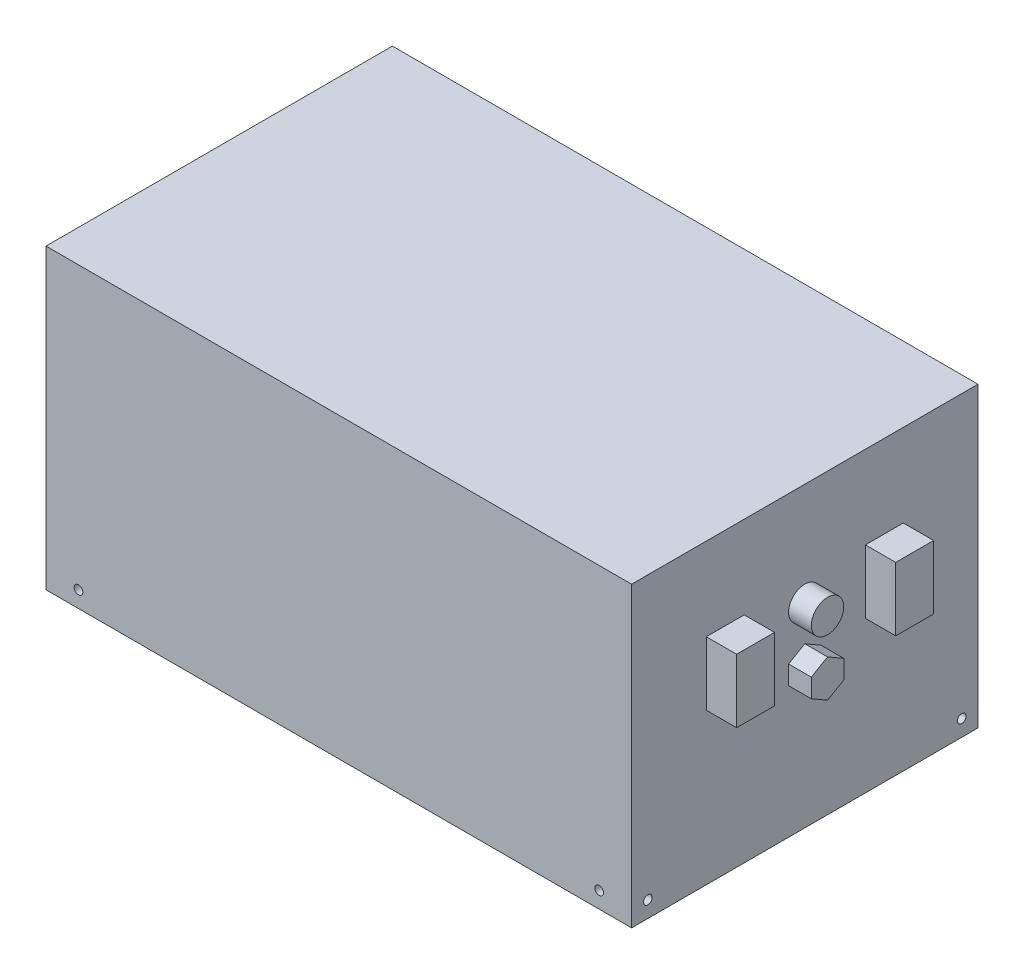
ISO-10303-21;
HEADER;
FILE_DESCRIPTION(('STEP AP214'),'2;1');
FILE_NAME('part.step','',(''),(''),'','','');
FILE_SCHEMA(('AUTOMOTIVE_DESIGN { 1 0 10303 214 1 1 1 1 }'));
ENDSEC;
DATA;
#1=APPLICATION_CONTEXT('core data for automotive mechanical design processes');
#2=APPLICATION_PROTOCOL_DEFINITION('international standard','automotive_design',2000,#1);
#3=PRODUCT_CONTEXT('',#1,'mechanical');
#4=PRODUCT('Part','Part','',(#3));
#5=PRODUCT_RELATED_PRODUCT_CATEGORY('part','',(#4));
#6=PRODUCT_DEFINITION_FORMATION('','',#4);
#7=PRODUCT_DEFINITION_CONTEXT('part definition',#1,'design');
#8=PRODUCT_DEFINITION('design','',#6,#7);
#9=PRODUCT_DEFINITION_SHAPE('','',#8);
#10=(LENGTH_UNIT() NAMED_UNIT(*) SI_UNIT(.MILLI.,.METRE.));
#11=(NAMED_UNIT(*) PLANE_ANGLE_UNIT() SI_UNIT($,.RADIAN.));
#12=(NAMED_UNIT(*) SI_UNIT($,.STERADIAN.) SOLID_ANGLE_UNIT());
#13=UNCERTAINTY_MEASURE_WITH_UNIT(LENGTH_MEASURE(1.E-05),#10,'distance_accuracy_value','');
#14=(GEOMETRIC_REPRESENTATION_CONTEXT(3) GLOBAL_UNCERTAINTY_ASSIGNED_CONTEXT((#13)) GLOBAL_UNIT_ASSIGNED_CONTEXT((#10,
#11,#12)) REPRESENTATION_CONTEXT('',''));
#15=CARTESIAN_POINT('',(0.,0.,0.));
#16=DIRECTION('',(0.,0.,1.));
#17=DIRECTION('',(1.,0.,0.));
#18=AXIS2_PLACEMENT_3D('',#15,#16,#17);
#19=CARTESIAN_POINT('',(270.5,275.,160.));
#20=DIRECTION('',(-1.,0.,0.));
#21=DIRECTION('',(0.,0.,1.));
#22=AXIS2_PLACEMENT_3D('',#19,#20,#21);
#23=PLANE('',#22);
#24=CARTESIAN_POINT('',(270.5,15.,145.));
#25=DIRECTION('',(1.,0.,0.));
#26=DIRECTION('',(0.,0.,-1.));
#27=AXIS2_PLACEMENT_3D('',#24,#25,#26);
#28=CIRCLE('',#27,3.99999999999999);
#29=CARTESIAN_POINT('',(270.5,15.,141.));
#30=VERTEX_POINT('',#29);
#31=EDGE_CURVE('E329',#30,#30,#28,.T.);
#32=ORIENTED_EDGE('',*,*,#31,.F.);
#33=EDGE_LOOP('',(#32));
#34=FACE_BOUND('',#33,.T.);
#35=CARTESIAN_POINT('',(270.5,15.,-145.));
#36=DIRECTION('',(1.,0.,0.));
#37=DIRECTION('',(0.,0.,-1.));
#38=AXIS2_PLACEMENT_3D('',#35,#36,#37);
#39=CIRCLE('',#38,3.99999999999999);
#40=CARTESIAN_POINT('',(270.5,15.,-149.));
#41=VERTEX_POINT('',#40);
#42=EDGE_CURVE('E333',#41,#41,#39,.T.);
#43=ORIENTED_EDGE('',*,*,#42,.F.);
#44=EDGE_LOOP('',(#43));
#45=FACE_BOUND('',#44,.T.);
#46=DIRECTION('',(0.,1.,0.));
#47=VECTOR('',#46,1.);
#48=CARTESIAN_POINT('',(270.5,198.45,-91.));
#49=LINE('',#48,#47);
#50=CARTESIAN_POINT('',(270.5,139.65,-91.));
#51=VERTEX_POINT('',#50);
#52=CARTESIAN_POINT('',(270.5,198.45,-91.));
#53=VERTEX_POINT('',#52);
#54=EDGE_CURVE('E187',#51,#53,#49,.T.);
#55=ORIENTED_EDGE('',*,*,#54,.F.);
#56=DIRECTION('',(0.,0.,-1.));
#57=VECTOR('',#56,1.);
#58=CARTESIAN_POINT('',(270.5,139.65,-56.));
#59=LINE('',#58,#57);
#60=CARTESIAN_POINT('',(270.5,139.65,-56.));
#61=VERTEX_POINT('',#60);
#62=EDGE_CURVE('E197',#61,#51,#59,.T.);
#63=ORIENTED_EDGE('',*,*,#62,.F.);
#64=DIRECTION('',(0.,-1.,0.));
#65=VECTOR('',#64,1.);
#66=CARTESIAN_POINT('',(270.5,198.45,-56.));
#67=LINE('',#66,#65);
#68=CARTESIAN_POINT('',(270.5,198.45,-56.));
#69=VERTEX_POINT('',#68);
#70=EDGE_CURVE('E209',#69,#61,#67,.T.);
#71=ORIENTED_EDGE('',*,*,#70,.F.);
#72=DIRECTION('',(0.,0.,1.));
#73=VECTOR('',#72,1.);
#74=CARTESIAN_POINT('',(270.5,198.45,-56.));
#75=LINE('',#74,#73);
#76=EDGE_CURVE('E206',#53,#69,#75,.T.);
#77=ORIENTED_EDGE('',*,*,#76,.F.);
#78=EDGE_LOOP('',(#55,#63,#71,#77));
#79=FACE_BOUND('',#78,.T.);
#80=DIRECTION('',(0.,0.,-1.));
#81=VECTOR('',#80,1.);
#82=CARTESIAN_POINT('',(270.5,0.,160.));
#83=LINE('',#82,#81);
#84=CARTESIAN_POINT('',(270.5,0.,160.));
#85=VERTEX_POINT('',#84);
#86=CARTESIAN_POINT('',(270.5,0.,-160.));
#87=VERTEX_POINT('',#86);
#88=EDGE_CURVE('E259',#85,#87,#83,.T.);
#89=ORIENTED_EDGE('',*,*,#88,.T.);
#90=DIRECTION('',(0.,-1.,0.));
#91=VECTOR('',#90,1.);
#92=CARTESIAN_POINT('',(270.5,275.,-160.));
#93=LINE('',#92,#91);
#94=CARTESIAN_POINT('',(270.5,275.,-160.));
#95=VERTEX_POINT('',#94);
#96=EDGE_CURVE('E46',#95,#87,#93,.T.);
#97=ORIENTED_EDGE('',*,*,#96,.F.);
#98=DIRECTION('',(0.,0.,-1.));
#99=VECTOR('',#98,1.);
#100=CARTESIAN_POINT('',(270.5,275.,160.));
#101=LINE('',#100,#99);
#102=CARTESIAN_POINT('',(270.5,275.,160.));
#103=VERTEX_POINT('',#102);
#104=EDGE_CURVE('E260',#103,#95,#101,.T.);
#105=ORIENTED_EDGE('',*,*,#104,.F.);
#106=DIRECTION('',(0.,-1.,0.));
#107=VECTOR('',#106,1.);
#108=CARTESIAN_POINT('',(270.5,275.,160.));
#109=LINE('',#108,#107);
#110=EDGE_CURVE('E272',#103,#85,#109,.T.);
#111=ORIENTED_EDGE('',*,*,#110,.T.);
#112=EDGE_LOOP('',(#89,#97,#105,#111));
#113=FACE_BOUND('',#112,.T.);
#114=DIRECTION('',(0.,1.,0.));
#115=VECTOR('',#114,1.);
#116=CARTESIAN_POINT('',(270.5,198.45,55.9999999999999));
#117=LINE('',#116,#115);
#118=CARTESIAN_POINT('',(270.5,139.65,55.9999999999999));
#119=VERTEX_POINT('',#118);
#120=CARTESIAN_POINT('',(270.5,198.45,55.9999999999999));
#121=VERTEX_POINT('',#120);
#122=EDGE_CURVE('E225',#119,#121,#117,.T.);
#123=ORIENTED_EDGE('',*,*,#122,.F.);
#124=DIRECTION('',(0.,0.,-1.));
#125=VECTOR('',#124,1.);
#126=CARTESIAN_POINT('',(270.5,139.65,90.9999999999999));
#127=LINE('',#126,#125);
#128=CARTESIAN_POINT('',(270.5,139.65,90.9999999999999));
#129=VERTEX_POINT('',#128);
#130=EDGE_CURVE('E230',#129,#119,#127,.T.);
#131=ORIENTED_EDGE('',*,*,#130,.F.);
#132=DIRECTION('',(0.,-1.,0.));
#133=VECTOR('',#132,1.);
#134=CARTESIAN_POINT('',(270.5,198.45,90.9999999999999));
#135=LINE('',#134,#133);
#136=CARTESIAN_POINT('',(270.5,198.45,90.9999999999999));
#137=VERTEX_POINT('',#136);
#138=EDGE_CURVE('E243',#137,#129,#135,.T.);
#139=ORIENTED_EDGE('',*,*,#138,.F.);
#140=DIRECTION('',(0.,0.,1.));
#141=VECTOR('',#140,1.);
#142=CARTESIAN_POINT('',(270.5,198.45,90.9999999999999));
#143=LINE('',#142,#141);
#144=EDGE_CURVE('E239',#121,#137,#143,.T.);
#145=ORIENTED_EDGE('',*,*,#144,.F.);
#146=EDGE_LOOP('',(#123,#131,#139,#145));
#147=FACE_BOUND('',#146,.T.);
#148=CARTESIAN_POINT('',(270.5,180.,0.));
#149=DIRECTION('',(-1.,0.,0.));
#150=DIRECTION('',(0.,0.,1.));
#151=AXIS2_PLACEMENT_3D('',#148,#149,#150);
#152=CIRCLE('',#151,15.);
#153=CARTESIAN_POINT('',(270.5,180.,15.));
#154=VERTEX_POINT('',#153);
#155=EDGE_CURVE('E11',#154,#154,#152,.F.);
#156=ORIENTED_EDGE('',*,*,#155,.F.);
#157=EDGE_LOOP('',(#156));
#158=FACE_BOUND('',#157,.T.);
#159=DIRECTION('',(0.,0.500000000000001,0.866025403784438));
#160=VECTOR('',#159,1.);
#161=CARTESIAN_POINT('',(270.5,138.660254037844,-15.));
#162=LINE('',#161,#160);
#163=CARTESIAN_POINT('',(270.5,138.660254037844,-15.));
#164=VERTEX_POINT('',#163);
#165=CARTESIAN_POINT('',(270.5,147.320508075689,0.));
#166=VERTEX_POINT('',#165);
#167=EDGE_CURVE('E183',#164,#166,#162,.T.);
#168=ORIENTED_EDGE('',*,*,#167,.F.);
#169=DIRECTION('',(0.,1.,0.));
#170=VECTOR('',#169,1.);
#171=CARTESIAN_POINT('',(270.5,121.339745962156,-15.));
#172=LINE('',#171,#170);
#173=CARTESIAN_POINT('',(270.5,121.339745962156,-15.));
#174=VERTEX_POINT('',#173);
#175=EDGE_CURVE('E180',#174,#164,#172,.T.);
#176=ORIENTED_EDGE('',*,*,#175,.F.);
#177=DIRECTION('',(0.,0.5,-0.866025403784439));
#178=VECTOR('',#177,1.);
#179=CARTESIAN_POINT('',(270.5,112.679491924311,0.));
#180=LINE('',#179,#178);
#181=CARTESIAN_POINT('',(270.5,112.679491924311,0.));
#182=VERTEX_POINT('',#181);
#183=EDGE_CURVE('E399',#182,#174,#180,.T.);
#184=ORIENTED_EDGE('',*,*,#183,.F.);
#185=DIRECTION('',(0.,-0.499999999999999,-0.866025403784439));
#186=VECTOR('',#185,1.);
#187=CARTESIAN_POINT('',(270.5,121.339745962156,15.));
#188=LINE('',#187,#186);
#189=CARTESIAN_POINT('',(270.5,121.339745962156,15.));
#190=VERTEX_POINT('',#189);
#191=EDGE_CURVE('E416',#190,#182,#188,.T.);
#192=ORIENTED_EDGE('',*,*,#191,.F.);
#193=DIRECTION('',(0.,-1.,0.));
#194=VECTOR('',#193,1.);
#195=CARTESIAN_POINT('',(270.5,138.660254037844,15.));
#196=LINE('',#195,#194);
#197=CARTESIAN_POINT('',(270.5,138.660254037844,15.));
#198=VERTEX_POINT('',#197);
#199=EDGE_CURVE('E58',#198,#190,#196,.T.);
#200=ORIENTED_EDGE('',*,*,#199,.F.);
#201=DIRECTION('',(0.,-0.500000000000001,0.866025403784438));
#202=VECTOR('',#201,1.);
#203=CARTESIAN_POINT('',(270.5,147.320508075689,0.));
#204=LINE('',#203,#202);
#205=EDGE_CURVE('E53',#166,#198,#204,.T.);
#206=ORIENTED_EDGE('',*,*,#205,.F.);
#207=EDGE_LOOP('',(#168,#176,#184,#192,#200,#206));
#208=FACE_BOUND('',#207,.T.);
#209=ADVANCED_FACE('F39',(#34,#45,#79,#113,#147,#158,#208),#23,.F.);
#210=CARTESIAN_POINT('',(-270.5,275.,-160.));
#211=DIRECTION('',(0.,0.,1.));
#212=DIRECTION('',(1.,0.,0.));
#213=AXIS2_PLACEMENT_3D('',#210,#211,#212);
#214=PLANE('',#213);
#215=DIRECTION('',(-1.,0.,0.));
#216=VECTOR('',#215,1.);
#217=CARTESIAN_POINT('',(-270.5,0.,-160.));
#218=LINE('',#217,#216);
#219=CARTESIAN_POINT('',(-270.5,0.,-160.));
#220=VERTEX_POINT('',#219);
#221=EDGE_CURVE('E275',#87,#220,#218,.T.);
#222=ORIENTED_EDGE('',*,*,#221,.T.);
#223=DIRECTION('',(0.,-1.,0.));
#224=VECTOR('',#223,1.);
#225=CARTESIAN_POINT('',(-270.5,275.,-160.));
#226=LINE('',#225,#224);
#227=CARTESIAN_POINT('',(-270.5,275.,-160.));
#228=VERTEX_POINT('',#227);
#229=EDGE_CURVE('E285',#228,#220,#226,.T.);
#230=ORIENTED_EDGE('',*,*,#229,.F.);
#231=DIRECTION('',(-1.,0.,0.));
#232=VECTOR('',#231,1.);
#233=CARTESIAN_POINT('',(-270.5,275.,-160.));
#234=LINE('',#233,#232);
#235=EDGE_CURVE('E264',#95,#228,#234,.T.);
#236=ORIENTED_EDGE('',*,*,#235,.F.);
#237=ORIENTED_EDGE('',*,*,#96,.T.);
#238=EDGE_LOOP('',(#222,#230,#236,#237));
#239=FACE_BOUND('',#238,.T.);
#240=ADVANCED_FACE('F290',(#239),#214,.F.);
#241=CARTESIAN_POINT('',(-270.5,275.,160.));
#242=DIRECTION('',(1.,0.,0.));
#243=DIRECTION('',(0.,0.,-1.));
#244=AXIS2_PLACEMENT_3D('',#241,#242,#243);
#245=PLANE('',#244);
#246=CARTESIAN_POINT('',(-270.5,15.,145.));
#247=DIRECTION('',(1.,0.,0.));
#248=DIRECTION('',(0.,0.,-1.));
#249=AXIS2_PLACEMENT_3D('',#246,#247,#248);
#250=CIRCLE('',#249,3.99999999999999);
#251=CARTESIAN_POINT('',(-270.5,15.,141.));
#252=VERTEX_POINT('',#251);
#253=EDGE_CURVE('E445',#252,#252,#250,.T.);
#254=ORIENTED_EDGE('',*,*,#253,.T.);
#255=EDGE_LOOP('',(#254));
#256=FACE_BOUND('',#255,.T.);
#257=CARTESIAN_POINT('',(-270.5,15.,-145.));
#258=DIRECTION('',(1.,0.,0.));
#259=DIRECTION('',(0.,0.,-1.));
#260=AXIS2_PLACEMENT_3D('',#257,#258,#259);
#261=CIRCLE('',#260,3.99999999999999);
#262=CARTESIAN_POINT('',(-270.5,15.,-149.));
#263=VERTEX_POINT('',#262);
#264=EDGE_CURVE('E438',#263,#263,#261,.T.);
#265=ORIENTED_EDGE('',*,*,#264,.T.);
#266=EDGE_LOOP('',(#265));
#267=FACE_BOUND('',#266,.T.);
#268=DIRECTION('',(0.,0.,1.));
#269=VECTOR('',#268,1.);
#270=CARTESIAN_POINT('',(-270.5,0.,160.));
#271=LINE('',#270,#269);
#272=CARTESIAN_POINT('',(-270.5,0.,160.));
#273=VERTEX_POINT('',#272);
#274=EDGE_CURVE('E277',#220,#273,#271,.T.);
#275=ORIENTED_EDGE('',*,*,#274,.T.);
#276=DIRECTION('',(0.,-1.,0.));
#277=VECTOR('',#276,1.);
#278=CARTESIAN_POINT('',(-270.5,275.,160.));
#279=LINE('',#278,#277);
#280=CARTESIAN_POINT('',(-270.5,275.,160.));
#281=VERTEX_POINT('',#280);
#282=EDGE_CURVE('E282',#281,#273,#279,.T.);
#283=ORIENTED_EDGE('',*,*,#282,.F.);
#284=DIRECTION('',(0.,0.,1.));
#285=VECTOR('',#284,1.);
#286=CARTESIAN_POINT('',(-270.5,275.,160.));
#287=LINE('',#286,#285);
#288=EDGE_CURVE('E267',#228,#281,#287,.T.);
#289=ORIENTED_EDGE('',*,*,#288,.F.);
#290=ORIENTED_EDGE('',*,*,#229,.T.);
#291=EDGE_LOOP('',(#275,#283,#289,#290));
#292=FACE_BOUND('',#291,.T.);
#293=ADVANCED_FACE('F303',(#256,#267,#292),#245,.F.);
#294=CARTESIAN_POINT('',(-270.5,275.,160.));
#295=DIRECTION('',(0.,0.,-1.));
#296=DIRECTION('',(-1.,0.,0.));
#297=AXIS2_PLACEMENT_3D('',#294,#295,#296);
#298=PLANE('',#297);
#299=CARTESIAN_POINT('',(-240.5,15.,160.));
#300=DIRECTION('',(0.,0.,1.));
#301=DIRECTION('',(1.,0.,0.));
#302=AXIS2_PLACEMENT_3D('',#299,#300,#301);
#303=CIRCLE('',#302,3.99999999999999);
#304=CARTESIAN_POINT('',(-236.5,15.,160.));
#305=VERTEX_POINT('',#304);
#306=EDGE_CURVE('E456',#305,#305,#303,.T.);
#307=ORIENTED_EDGE('',*,*,#306,.F.);
#308=EDGE_LOOP('',(#307));
#309=FACE_BOUND('',#308,.T.);
#310=CARTESIAN_POINT('',(240.5,15.,160.));
#311=DIRECTION('',(0.,0.,1.));
#312=DIRECTION('',(1.,0.,0.));
#313=AXIS2_PLACEMENT_3D('',#310,#311,#312);
#314=CIRCLE('',#313,3.99999999999999);
#315=CARTESIAN_POINT('',(244.5,15.,160.));
#316=VERTEX_POINT('',#315);
#317=EDGE_CURVE('E450',#316,#316,#314,.T.);
#318=ORIENTED_EDGE('',*,*,#317,.F.);
#319=EDGE_LOOP('',(#318));
#320=FACE_BOUND('',#319,.T.);
#321=DIRECTION('',(1.,0.,0.));
#322=VECTOR('',#321,1.);
#323=CARTESIAN_POINT('',(-270.5,0.,160.));
#324=LINE('',#323,#322);
#325=EDGE_CURVE('E265',#273,#85,#324,.T.);
#326=ORIENTED_EDGE('',*,*,#325,.T.);
#327=ORIENTED_EDGE('',*,*,#110,.F.);
#328=DIRECTION('',(1.,0.,0.));
#329=VECTOR('',#328,1.);
#330=CARTESIAN_POINT('',(-270.5,275.,160.));
#331=LINE('',#330,#329);
#332=EDGE_CURVE('E269',#281,#103,#331,.T.);
#333=ORIENTED_EDGE('',*,*,#332,.F.);
#334=ORIENTED_EDGE('',*,*,#282,.T.);
#335=EDGE_LOOP('',(#326,#327,#333,#334));
#336=FACE_BOUND('',#335,.T.);
#337=ADVANCED_FACE('F307',(#309,#320,#336),#298,.F.);
#338=CARTESIAN_POINT('',(0.,275.,0.));
#339=DIRECTION('',(0.,-1.,0.));
#340=DIRECTION('',(0.,0.,-1.));
#341=AXIS2_PLACEMENT_3D('',#338,#339,#340);
#342=PLANE('',#341);
#343=ORIENTED_EDGE('',*,*,#104,.T.);
#344=ORIENTED_EDGE('',*,*,#235,.T.);
#345=ORIENTED_EDGE('',*,*,#288,.T.);
#346=ORIENTED_EDGE('',*,*,#332,.T.);
#347=EDGE_LOOP('',(#343,#344,#345,#346));
#348=FACE_BOUND('',#347,.T.);
#349=ADVANCED_FACE('F309',(#348),#342,.F.);
#350=CARTESIAN_POINT('',(0.,0.,0.));
#351=DIRECTION('',(0.,-1.,0.));
#352=DIRECTION('',(0.,0.,-1.));
#353=AXIS2_PLACEMENT_3D('',#350,#351,#352);
#354=PLANE('',#353);
#355=ORIENTED_EDGE('',*,*,#88,.F.);
#356=ORIENTED_EDGE('',*,*,#325,.F.);
#357=ORIENTED_EDGE('',*,*,#274,.F.);
#358=ORIENTED_EDGE('',*,*,#221,.F.);
#359=EDGE_LOOP('',(#355,#356,#357,#358));
#360=FACE_BOUND('',#359,.T.);
#361=ADVANCED_FACE('F299',(#360),#354,.T.);
#362=CARTESIAN_POINT('',(298.5,198.45,55.9999999999999));
#363=DIRECTION('',(0.,0.,1.));
#364=DIRECTION('',(1.,0.,0.));
#365=AXIS2_PLACEMENT_3D('',#362,#363,#364);
#366=PLANE('',#365);
#367=ORIENTED_EDGE('',*,*,#122,.T.);
#368=DIRECTION('',(-1.,0.,0.));
#369=VECTOR('',#368,1.);
#370=CARTESIAN_POINT('',(298.5,198.45,55.9999999999999));
#371=LINE('',#370,#369);
#372=CARTESIAN_POINT('',(298.5,198.45,55.9999999999999));
#373=VERTEX_POINT('',#372);
#374=EDGE_CURVE('E256',#373,#121,#371,.T.);
#375=ORIENTED_EDGE('',*,*,#374,.F.);
#376=DIRECTION('',(0.,1.,0.));
#377=VECTOR('',#376,1.);
#378=CARTESIAN_POINT('',(298.5,198.45,55.9999999999999));
#379=LINE('',#378,#377);
#380=CARTESIAN_POINT('',(298.5,139.65,55.9999999999999));
#381=VERTEX_POINT('',#380);
#382=EDGE_CURVE('E226',#381,#373,#379,.T.);
#383=ORIENTED_EDGE('',*,*,#382,.F.);
#384=DIRECTION('',(-1.,0.,0.));
#385=VECTOR('',#384,1.);
#386=CARTESIAN_POINT('',(298.5,139.65,55.9999999999999));
#387=LINE('',#386,#385);
#388=EDGE_CURVE('E236',#381,#119,#387,.T.);
#389=ORIENTED_EDGE('',*,*,#388,.T.);
#390=EDGE_LOOP('',(#367,#375,#383,#389));
#391=FACE_BOUND('',#390,.T.);
#392=ADVANCED_FACE('F316',(#391),#366,.F.);
#393=CARTESIAN_POINT('',(298.5,198.45,90.9999999999999));
#394=DIRECTION('',(0.,-1.,0.));
#395=DIRECTION('',(0.,0.,-1.));
#396=AXIS2_PLACEMENT_3D('',#393,#394,#395);
#397=PLANE('',#396);
#398=ORIENTED_EDGE('',*,*,#144,.T.);
#399=DIRECTION('',(-1.,0.,0.));
#400=VECTOR('',#399,1.);
#401=CARTESIAN_POINT('',(298.5,198.45,90.9999999999999));
#402=LINE('',#401,#400);
#403=CARTESIAN_POINT('',(298.5,198.45,90.9999999999999));
#404=VERTEX_POINT('',#403);
#405=EDGE_CURVE('E253',#404,#137,#402,.T.);
#406=ORIENTED_EDGE('',*,*,#405,.F.);
#407=DIRECTION('',(0.,0.,1.));
#408=VECTOR('',#407,1.);
#409=CARTESIAN_POINT('',(298.5,198.45,90.9999999999999));
#410=LINE('',#409,#408);
#411=EDGE_CURVE('E229',#373,#404,#410,.T.);
#412=ORIENTED_EDGE('',*,*,#411,.F.);
#413=ORIENTED_EDGE('',*,*,#374,.T.);
#414=EDGE_LOOP('',(#398,#406,#412,#413));
#415=FACE_BOUND('',#414,.T.);
#416=ADVANCED_FACE('F372',(#415),#397,.F.);
#417=CARTESIAN_POINT('',(298.5,198.45,90.9999999999999));
#418=DIRECTION('',(0.,0.,-1.));
#419=DIRECTION('',(0.,1.,0.));
#420=AXIS2_PLACEMENT_3D('',#417,#418,#419);
#421=PLANE('',#420);
#422=ORIENTED_EDGE('',*,*,#138,.T.);
#423=DIRECTION('',(-1.,0.,0.));
#424=VECTOR('',#423,1.);
#425=CARTESIAN_POINT('',(298.5,139.65,90.9999999999999));
#426=LINE('',#425,#424);
#427=CARTESIAN_POINT('',(298.5,139.65,90.9999999999999));
#428=VERTEX_POINT('',#427);
#429=EDGE_CURVE('E250',#428,#129,#426,.T.);
#430=ORIENTED_EDGE('',*,*,#429,.F.);
#431=DIRECTION('',(0.,-1.,0.));
#432=VECTOR('',#431,1.);
#433=CARTESIAN_POINT('',(298.5,198.45,90.9999999999999));
#434=LINE('',#433,#432);
#435=EDGE_CURVE('E232',#404,#428,#434,.T.);
#436=ORIENTED_EDGE('',*,*,#435,.F.);
#437=ORIENTED_EDGE('',*,*,#405,.T.);
#438=EDGE_LOOP('',(#422,#430,#436,#437));
#439=FACE_BOUND('',#438,.T.);
#440=ADVANCED_FACE('F368',(#439),#421,.F.);
#441=CARTESIAN_POINT('',(298.5,139.65,90.9999999999999));
#442=DIRECTION('',(0.,1.,0.));
#443=DIRECTION('',(0.,0.,1.));
#444=AXIS2_PLACEMENT_3D('',#441,#442,#443);
#445=PLANE('',#444);
#446=ORIENTED_EDGE('',*,*,#130,.T.);
#447=ORIENTED_EDGE('',*,*,#388,.F.);
#448=DIRECTION('',(0.,0.,-1.));
#449=VECTOR('',#448,1.);
#450=CARTESIAN_POINT('',(298.5,139.65,90.9999999999999));
#451=LINE('',#450,#449);
#452=EDGE_CURVE('E234',#428,#381,#451,.T.);
#453=ORIENTED_EDGE('',*,*,#452,.F.);
#454=ORIENTED_EDGE('',*,*,#429,.T.);
#455=EDGE_LOOP('',(#446,#447,#453,#454));
#456=FACE_BOUND('',#455,.T.);
#457=ADVANCED_FACE('F364',(#456),#445,.F.);
#458=CARTESIAN_POINT('',(298.5,0.,0.));
#459=DIRECTION('',(1.,0.,0.));
#460=DIRECTION('',(0.,0.,-1.));
#461=AXIS2_PLACEMENT_3D('',#458,#459,#460);
#462=PLANE('',#461);
#463=ORIENTED_EDGE('',*,*,#382,.T.);
#464=ORIENTED_EDGE('',*,*,#411,.T.);
#465=ORIENTED_EDGE('',*,*,#435,.T.);
#466=ORIENTED_EDGE('',*,*,#452,.T.);
#467=EDGE_LOOP('',(#463,#464,#465,#466));
#468=FACE_BOUND('',#467,.T.);
#469=ADVANCED_FACE('F358',(#468),#462,.T.);
#470=CARTESIAN_POINT('',(298.5,198.45,-91.));
#471=DIRECTION('',(0.,0.,1.));
#472=DIRECTION('',(0.,-1.,0.));
#473=AXIS2_PLACEMENT_3D('',#470,#471,#472);
#474=PLANE('',#473);
#475=ORIENTED_EDGE('',*,*,#54,.T.);
#476=DIRECTION('',(-1.,0.,0.));
#477=VECTOR('',#476,1.);
#478=CARTESIAN_POINT('',(298.5,198.45,-91.));
#479=LINE('',#478,#477);
#480=CARTESIAN_POINT('',(298.5,198.45,-91.));
#481=VERTEX_POINT('',#480);
#482=EDGE_CURVE('E222',#481,#53,#479,.T.);
#483=ORIENTED_EDGE('',*,*,#482,.F.);
#484=DIRECTION('',(0.,1.,0.));
#485=VECTOR('',#484,1.);
#486=CARTESIAN_POINT('',(298.5,198.45,-91.));
#487=LINE('',#486,#485);
#488=CARTESIAN_POINT('',(298.5,139.65,-91.));
#489=VERTEX_POINT('',#488);
#490=EDGE_CURVE('E193',#489,#481,#487,.T.);
#491=ORIENTED_EDGE('',*,*,#490,.F.);
#492=DIRECTION('',(-1.,0.,0.));
#493=VECTOR('',#492,1.);
#494=CARTESIAN_POINT('',(298.5,139.65,-91.));
#495=LINE('',#494,#493);
#496=EDGE_CURVE('E203',#489,#51,#495,.T.);
#497=ORIENTED_EDGE('',*,*,#496,.T.);
#498=EDGE_LOOP('',(#475,#483,#491,#497));
#499=FACE_BOUND('',#498,.T.);
#500=ADVANCED_FACE('F342',(#499),#474,.F.);
#501=CARTESIAN_POINT('',(298.5,198.45,-56.));
#502=DIRECTION('',(0.,-1.,0.));
#503=DIRECTION('',(0.,0.,-1.));
#504=AXIS2_PLACEMENT_3D('',#501,#502,#503);
#505=PLANE('',#504);
#506=ORIENTED_EDGE('',*,*,#76,.T.);
#507=DIRECTION('',(-1.,0.,0.));
#508=VECTOR('',#507,1.);
#509=CARTESIAN_POINT('',(298.5,198.45,-56.));
#510=LINE('',#509,#508);
#511=CARTESIAN_POINT('',(298.5,198.45,-56.));
#512=VERTEX_POINT('',#511);
#513=EDGE_CURVE('E219',#512,#69,#510,.T.);
#514=ORIENTED_EDGE('',*,*,#513,.F.);
#515=DIRECTION('',(0.,0.,1.));
#516=VECTOR('',#515,1.);
#517=CARTESIAN_POINT('',(298.5,198.45,-56.));
#518=LINE('',#517,#516);
#519=EDGE_CURVE('E196',#481,#512,#518,.T.);
#520=ORIENTED_EDGE('',*,*,#519,.F.);
#521=ORIENTED_EDGE('',*,*,#482,.T.);
#522=EDGE_LOOP('',(#506,#514,#520,#521));
#523=FACE_BOUND('',#522,.T.);
#524=ADVANCED_FACE('F350',(#523),#505,.F.);
#525=CARTESIAN_POINT('',(298.5,198.45,-56.));
#526=DIRECTION('',(0.,0.,-1.));
#527=DIRECTION('',(0.,1.,0.));
#528=AXIS2_PLACEMENT_3D('',#525,#526,#527);
#529=PLANE('',#528);
#530=ORIENTED_EDGE('',*,*,#70,.T.);
#531=DIRECTION('',(-1.,0.,0.));
#532=VECTOR('',#531,1.);
#533=CARTESIAN_POINT('',(298.5,139.65,-56.));
#534=LINE('',#533,#532);
#535=CARTESIAN_POINT('',(298.5,139.65,-56.));
#536=VERTEX_POINT('',#535);
#537=EDGE_CURVE('E216',#536,#61,#534,.T.);
#538=ORIENTED_EDGE('',*,*,#537,.F.);
#539=DIRECTION('',(0.,-1.,0.));
#540=VECTOR('',#539,1.);
#541=CARTESIAN_POINT('',(298.5,198.45,-56.));
#542=LINE('',#541,#540);
#543=EDGE_CURVE('E199',#512,#536,#542,.T.);
#544=ORIENTED_EDGE('',*,*,#543,.F.);
#545=ORIENTED_EDGE('',*,*,#513,.T.);
#546=EDGE_LOOP('',(#530,#538,#544,#545));
#547=FACE_BOUND('',#546,.T.);
#548=ADVANCED_FACE('F348',(#547),#529,.F.);
#549=CARTESIAN_POINT('',(298.5,139.65,-56.));
#550=DIRECTION('',(0.,1.,0.));
#551=DIRECTION('',(0.,0.,1.));
#552=AXIS2_PLACEMENT_3D('',#549,#550,#551);
#553=PLANE('',#552);
#554=ORIENTED_EDGE('',*,*,#62,.T.);
#555=ORIENTED_EDGE('',*,*,#496,.F.);
#556=DIRECTION('',(0.,0.,-1.));
#557=VECTOR('',#556,1.);
#558=CARTESIAN_POINT('',(298.5,139.65,-56.));
#559=LINE('',#558,#557);
#560=EDGE_CURVE('E201',#536,#489,#559,.T.);
#561=ORIENTED_EDGE('',*,*,#560,.F.);
#562=ORIENTED_EDGE('',*,*,#537,.T.);
#563=EDGE_LOOP('',(#554,#555,#561,#562));
#564=FACE_BOUND('',#563,.T.);
#565=ADVANCED_FACE('F338',(#564),#553,.F.);
#566=CARTESIAN_POINT('',(298.5,0.,0.));
#567=DIRECTION('',(1.,0.,0.));
#568=DIRECTION('',(0.,0.,-1.));
#569=AXIS2_PLACEMENT_3D('',#566,#567,#568);
#570=PLANE('',#569);
#571=ORIENTED_EDGE('',*,*,#490,.T.);
#572=ORIENTED_EDGE('',*,*,#519,.T.);
#573=ORIENTED_EDGE('',*,*,#543,.T.);
#574=ORIENTED_EDGE('',*,*,#560,.T.);
#575=EDGE_LOOP('',(#571,#572,#573,#574));
#576=FACE_BOUND('',#575,.T.);
#577=ADVANCED_FACE('F344',(#576),#570,.T.);
#578=CARTESIAN_POINT('',(291.5,180.,0.));
#579=DIRECTION('',(-1.,0.,0.));
#580=DIRECTION('',(0.,0.,1.));
#581=AXIS2_PLACEMENT_3D('',#578,#579,#580);
#582=CYLINDRICAL_SURFACE('',#581,15.);
#583=CARTESIAN_POINT('',(291.5,180.,0.));
#584=DIRECTION('',(1.,0.,0.));
#585=DIRECTION('',(0.,0.,-1.));
#586=AXIS2_PLACEMENT_3D('',#583,#584,#585);
#587=CIRCLE('',#586,15.);
#588=CARTESIAN_POINT('',(291.5,180.,15.));
#589=VERTEX_POINT('',#588);
#590=EDGE_CURVE('E184',#589,#589,#587,.T.);
#591=CARTESIAN_POINT('',(291.5,180.,15.));
#592=CARTESIAN_POINT('',(291.28125,180.,15.));
#593=CARTESIAN_POINT('',(291.0625,180.,15.));
#594=CARTESIAN_POINT('',(290.625,180.,15.));
#595=CARTESIAN_POINT('',(290.40625,180.,15.));
#596=CARTESIAN_POINT('',(289.96875,180.,15.));
#597=CARTESIAN_POINT('',(289.75,180.,15.));
#598=CARTESIAN_POINT('',(289.3125,180.,15.));
#599=CARTESIAN_POINT('',(289.09375,180.,15.));
#600=CARTESIAN_POINT('',(288.65625,180.,15.));
#601=CARTESIAN_POINT('',(288.4375,180.,15.));
#602=CARTESIAN_POINT('',(288.,180.,15.));
#603=CARTESIAN_POINT('',(287.78125,180.,15.));
#604=CARTESIAN_POINT('',(287.34375,180.,15.));
#605=CARTESIAN_POINT('',(287.125,180.,15.));
#606=CARTESIAN_POINT('',(286.6875,180.,15.));
#607=CARTESIAN_POINT('',(286.46875,180.,15.));
#608=CARTESIAN_POINT('',(286.03125,180.,15.));
#609=CARTESIAN_POINT('',(285.8125,180.,15.));
#610=CARTESIAN_POINT('',(285.375,180.,15.));
#611=CARTESIAN_POINT('',(285.15625,180.,15.));
#612=CARTESIAN_POINT('',(284.71875,180.,15.));
#613=CARTESIAN_POINT('',(284.5,180.,15.));
#614=CARTESIAN_POINT('',(284.0625,180.,15.));
#615=CARTESIAN_POINT('',(283.84375,180.,15.));
#616=CARTESIAN_POINT('',(283.40625,180.,15.));
#617=CARTESIAN_POINT('',(283.1875,180.,15.));
#618=CARTESIAN_POINT('',(282.75,180.,15.));
#619=CARTESIAN_POINT('',(282.53125,180.,15.));
#620=CARTESIAN_POINT('',(282.09375,180.,15.));
#621=CARTESIAN_POINT('',(281.875,180.,15.));
#622=CARTESIAN_POINT('',(281.4375,180.,15.));
#623=CARTESIAN_POINT('',(281.21875,180.,15.));
#624=CARTESIAN_POINT('',(280.78125,180.,15.));
#625=CARTESIAN_POINT('',(280.5625,180.,15.));
#626=CARTESIAN_POINT('',(280.125,180.,15.));
#627=CARTESIAN_POINT('',(279.90625,180.,15.));
#628=CARTESIAN_POINT('',(279.46875,180.,15.));
#629=CARTESIAN_POINT('',(279.25,180.,15.));
#630=CARTESIAN_POINT('',(278.8125,180.,15.));
#631=CARTESIAN_POINT('',(278.59375,180.,15.));
#632=CARTESIAN_POINT('',(278.15625,180.,15.));
#633=CARTESIAN_POINT('',(277.9375,180.,15.));
#634=CARTESIAN_POINT('',(277.5,180.,15.));
#635=CARTESIAN_POINT('',(277.28125,180.,15.));
#636=CARTESIAN_POINT('',(276.84375,180.,15.));
#637=CARTESIAN_POINT('',(276.625,180.,15.));
#638=CARTESIAN_POINT('',(276.1875,180.,15.));
#639=CARTESIAN_POINT('',(275.96875,180.,15.));
#640=CARTESIAN_POINT('',(275.53125,180.,15.));
#641=CARTESIAN_POINT('',(275.3125,180.,15.));
#642=CARTESIAN_POINT('',(274.875,180.,15.));
#643=CARTESIAN_POINT('',(274.65625,180.,15.));
#644=CARTESIAN_POINT('',(274.21875,180.,15.));
#645=CARTESIAN_POINT('',(274.,180.,15.));
#646=CARTESIAN_POINT('',(273.5625,180.,15.));
#647=CARTESIAN_POINT('',(273.34375,180.,15.));
#648=CARTESIAN_POINT('',(272.90625,180.,15.));
#649=CARTESIAN_POINT('',(272.6875,180.,15.));
#650=CARTESIAN_POINT('',(272.25,180.,15.));
#651=CARTESIAN_POINT('',(272.03125,180.,15.));
#652=CARTESIAN_POINT('',(271.59375,180.,15.));
#653=CARTESIAN_POINT('',(271.375,180.,15.));
#654=CARTESIAN_POINT('',(270.9375,180.,15.));
#655=CARTESIAN_POINT('',(270.71875,180.,15.));
#656=CARTESIAN_POINT('',(270.5,180.,15.));
#657=B_SPLINE_CURVE_WITH_KNOTS('',3,(#591,#592,#593,#594,#595,#596,#597,#598,#599,#600,#601,
#602,#603,#604,#605,#606,#607,#608,#609,#610,#611,#612,#613,#614,#615,#616,#617,#618,#619,#620,
#621,#622,#623,#624,#625,#626,#627,#628,#629,#630,#631,#632,#633,#634,#635,#636,#637,#638,#639,
#640,#641,#642,#643,#644,#645,#646,#647,#648,#649,#650,#651,#652,#653,#654,#655,#656),
.UNSPECIFIED.,.F.,.F.,(4,2,2,2,2,2,2,2,2,2,2,2,2,2,2,2,2,2,2,2,2,2,2,2,2,2,2,2,2,2,2,2,4),(0.,
0.656249999999969,1.31249999999999,1.96874999999996,2.62499999999999,3.28124999999996,
3.93749999999998,4.59374999999995,5.24999999999998,5.90624999999995,6.56249999999997,
7.21874999999994,7.87499999999997,8.53124999999993,9.18749999999996,9.84374999999993,10.5,
11.1562499999999,11.8124999999999,12.46875,13.1249999999999,13.78125,14.4374999999999,15.09375,
15.7499999999999,16.40625,17.0624999999999,17.71875,18.3749999999999,19.0312499999999,
19.6874999999999,20.3437499999999,20.9999999999999),.UNSPECIFIED.);
#658=EDGE_CURVE('BSEAM533',#589,#154,#657,.T.);
#659=ORIENTED_EDGE('',*,*,#590,.F.);
#660=ORIENTED_EDGE('',*,*,#155,.T.);
#661=ORIENTED_EDGE('',*,*,#658,.T.);
#662=ORIENTED_EDGE('',*,*,#658,.F.);
#663=EDGE_LOOP('',(#659,#661,#660,#662));
#664=FACE_BOUND('',#663,.T.);
#665=ADVANCED_FACE('F533',(#664),#582,.T.);
#666=CARTESIAN_POINT('',(291.5,180.,0.));
#667=DIRECTION('',(1.,0.,0.));
#668=DIRECTION('',(0.,0.,-1.));
#669=AXIS2_PLACEMENT_3D('',#666,#667,#668);
#670=PLANE('',#669);
#671=ORIENTED_EDGE('',*,*,#590,.T.);
#672=EDGE_LOOP('',(#671));
#673=FACE_BOUND('',#672,.T.);
#674=ADVANCED_FACE('F530',(#673),#670,.T.);
#675=CARTESIAN_POINT('',(291.5,138.660254037844,-15.));
#676=DIRECTION('',(0.,-0.866025403784438,0.500000000000001));
#677=DIRECTION('',(0.,-0.500000000000001,-0.866025403784438));
#678=AXIS2_PLACEMENT_3D('',#675,#676,#677);
#679=PLANE('',#678);
#680=ORIENTED_EDGE('',*,*,#167,.T.);
#681=DIRECTION('',(-1.,0.,0.));
#682=VECTOR('',#681,1.);
#683=CARTESIAN_POINT('',(291.5,147.320508075689,0.));
#684=LINE('',#683,#682);
#685=CARTESIAN_POINT('',(291.5,147.320508075689,0.));
#686=VERTEX_POINT('',#685);
#687=EDGE_CURVE('E164',#686,#166,#684,.T.);
#688=ORIENTED_EDGE('',*,*,#687,.F.);
#689=DIRECTION('',(0.,0.500000000000001,0.866025403784438));
#690=VECTOR('',#689,1.);
#691=CARTESIAN_POINT('',(291.5,138.660254037844,-15.));
#692=LINE('',#691,#690);
#693=CARTESIAN_POINT('',(291.5,138.660254037844,-15.));
#694=VERTEX_POINT('',#693);
#695=EDGE_CURVE('E171',#694,#686,#692,.T.);
#696=ORIENTED_EDGE('',*,*,#695,.F.);
#697=DIRECTION('',(-1.,0.,0.));
#698=VECTOR('',#697,1.);
#699=CARTESIAN_POINT('',(291.5,138.660254037844,-15.));
#700=LINE('',#699,#698);
#701=EDGE_CURVE('E396',#694,#164,#700,.T.);
#702=ORIENTED_EDGE('',*,*,#701,.T.);
#703=EDGE_LOOP('',(#680,#688,#696,#702));
#704=FACE_BOUND('',#703,.T.);
#705=ADVANCED_FACE('F182',(#704),#679,.F.);
#706=CARTESIAN_POINT('',(291.5,147.320508075689,0.));
#707=DIRECTION('',(0.,-0.866025403784438,-0.5));
#708=DIRECTION('',(0.,0.500000000000001,-0.866025403784438));
#709=AXIS2_PLACEMENT_3D('',#706,#707,#708);
#710=PLANE('',#709);
#711=ORIENTED_EDGE('',*,*,#205,.T.);
#712=DIRECTION('',(-1.,0.,0.));
#713=VECTOR('',#712,1.);
#714=CARTESIAN_POINT('',(291.5,138.660254037844,15.));
#715=LINE('',#714,#713);
#716=CARTESIAN_POINT('',(291.5,138.660254037844,15.));
#717=VERTEX_POINT('',#716);
#718=EDGE_CURVE('E167',#717,#198,#715,.T.);
#719=ORIENTED_EDGE('',*,*,#718,.F.);
#720=DIRECTION('',(0.,-0.500000000000001,0.866025403784438));
#721=VECTOR('',#720,1.);
#722=CARTESIAN_POINT('',(291.5,147.320508075689,0.));
#723=LINE('',#722,#721);
#724=EDGE_CURVE('E160',#686,#717,#723,.T.);
#725=ORIENTED_EDGE('',*,*,#724,.F.);
#726=ORIENTED_EDGE('',*,*,#687,.T.);
#727=EDGE_LOOP('',(#711,#719,#725,#726));
#728=FACE_BOUND('',#727,.T.);
#729=ADVANCED_FACE('F162',(#728),#710,.F.);
#730=CARTESIAN_POINT('',(291.5,138.660254037844,15.));
#731=DIRECTION('',(0.,0.,-1.));
#732=DIRECTION('',(0.,1.,0.));
#733=AXIS2_PLACEMENT_3D('',#730,#731,#732);
#734=PLANE('',#733);
#735=ORIENTED_EDGE('',*,*,#199,.T.);
#736=DIRECTION('',(-1.,0.,0.));
#737=VECTOR('',#736,1.);
#738=CARTESIAN_POINT('',(291.5,121.339745962156,15.));
#739=LINE('',#738,#737);
#740=CARTESIAN_POINT('',(291.5,121.339745962156,15.));
#741=VERTEX_POINT('',#740);
#742=EDGE_CURVE('E189',#741,#190,#739,.T.);
#743=ORIENTED_EDGE('',*,*,#742,.F.);
#744=DIRECTION('',(0.,-1.,0.));
#745=VECTOR('',#744,1.);
#746=CARTESIAN_POINT('',(291.5,138.660254037844,15.));
#747=LINE('',#746,#745);
#748=EDGE_CURVE('E170',#717,#741,#747,.T.);
#749=ORIENTED_EDGE('',*,*,#748,.F.);
#750=ORIENTED_EDGE('',*,*,#718,.T.);
#751=EDGE_LOOP('',(#735,#743,#749,#750));
#752=FACE_BOUND('',#751,.T.);
#753=ADVANCED_FACE('F419',(#752),#734,.F.);
#754=CARTESIAN_POINT('',(291.5,121.339745962156,15.));
#755=DIRECTION('',(0.,0.866025403784439,-0.499999999999999));
#756=DIRECTION('',(0.,0.499999999999999,0.866025403784439));
#757=AXIS2_PLACEMENT_3D('',#754,#755,#756);
#758=PLANE('',#757);
#759=ORIENTED_EDGE('',*,*,#191,.T.);
#760=DIRECTION('',(-1.,0.,0.));
#761=VECTOR('',#760,1.);
#762=CARTESIAN_POINT('',(291.5,112.679491924311,0.));
#763=LINE('',#762,#761);
#764=CARTESIAN_POINT('',(291.5,112.679491924311,0.));
#765=VERTEX_POINT('',#764);
#766=EDGE_CURVE('E402',#765,#182,#763,.T.);
#767=ORIENTED_EDGE('',*,*,#766,.F.);
#768=DIRECTION('',(0.,-0.499999999999999,-0.866025403784439));
#769=VECTOR('',#768,1.);
#770=CARTESIAN_POINT('',(291.5,121.339745962156,15.));
#771=LINE('',#770,#769);
#772=EDGE_CURVE('E417',#741,#765,#771,.T.);
#773=ORIENTED_EDGE('',*,*,#772,.F.);
#774=ORIENTED_EDGE('',*,*,#742,.T.);
#775=EDGE_LOOP('',(#759,#767,#773,#774));
#776=FACE_BOUND('',#775,.T.);
#777=ADVANCED_FACE('F414',(#776),#758,.F.);
#778=CARTESIAN_POINT('',(291.5,112.679491924311,0.));
#779=DIRECTION('',(0.,0.866025403784439,0.5));
#780=DIRECTION('',(0.,-0.5,0.866025403784439));
#781=AXIS2_PLACEMENT_3D('',#778,#779,#780);
#782=PLANE('',#781);
#783=ORIENTED_EDGE('',*,*,#183,.T.);
#784=DIRECTION('',(-1.,0.,0.));
#785=VECTOR('',#784,1.);
#786=CARTESIAN_POINT('',(291.5,121.339745962156,-15.));
#787=LINE('',#786,#785);
#788=CARTESIAN_POINT('',(291.5,121.339745962156,-15.));
#789=VERTEX_POINT('',#788);
#790=EDGE_CURVE('E398',#789,#174,#787,.T.);
#791=ORIENTED_EDGE('',*,*,#790,.F.);
#792=DIRECTION('',(0.,0.5,-0.866025403784439));
#793=VECTOR('',#792,1.);
#794=CARTESIAN_POINT('',(291.5,112.679491924311,0.));
#795=LINE('',#794,#793);
#796=EDGE_CURVE('E404',#765,#789,#795,.T.);
#797=ORIENTED_EDGE('',*,*,#796,.F.);
#798=ORIENTED_EDGE('',*,*,#766,.T.);
#799=EDGE_LOOP('',(#783,#791,#797,#798));
#800=FACE_BOUND('',#799,.T.);
#801=ADVANCED_FACE('F424',(#800),#782,.F.);
#802=CARTESIAN_POINT('',(291.5,121.339745962156,-15.));
#803=DIRECTION('',(0.,0.,1.));
#804=DIRECTION('',(0.,-1.,0.));
#805=AXIS2_PLACEMENT_3D('',#802,#803,#804);
#806=PLANE('',#805);
#807=ORIENTED_EDGE('',*,*,#175,.T.);
#808=ORIENTED_EDGE('',*,*,#701,.F.);
#809=DIRECTION('',(0.,1.,0.));
#810=VECTOR('',#809,1.);
#811=CARTESIAN_POINT('',(291.5,121.339745962156,-15.));
#812=LINE('',#811,#810);
#813=EDGE_CURVE('E176',#789,#694,#812,.T.);
#814=ORIENTED_EDGE('',*,*,#813,.F.);
#815=ORIENTED_EDGE('',*,*,#790,.T.);
#816=EDGE_LOOP('',(#807,#808,#814,#815));
#817=FACE_BOUND('',#816,.T.);
#818=ADVANCED_FACE('F395',(#817),#806,.F.);
#819=CARTESIAN_POINT('',(291.5,0.,0.));
#820=DIRECTION('',(1.,0.,0.));
#821=DIRECTION('',(0.,0.,-1.));
#822=AXIS2_PLACEMENT_3D('',#819,#820,#821);
#823=PLANE('',#822);
#824=ORIENTED_EDGE('',*,*,#695,.T.);
#825=ORIENTED_EDGE('',*,*,#724,.T.);
#826=ORIENTED_EDGE('',*,*,#748,.T.);
#827=ORIENTED_EDGE('',*,*,#772,.T.);
#828=ORIENTED_EDGE('',*,*,#796,.T.);
#829=ORIENTED_EDGE('',*,*,#813,.T.);
#830=EDGE_LOOP('',(#824,#825,#826,#827,#828,#829));
#831=FACE_BOUND('',#830,.T.);
#832=ADVANCED_FACE('F174',(#831),#823,.T.);
#833=CARTESIAN_POINT('',(255.5,15.,-145.));
#834=DIRECTION('',(1.,0.,0.));
#835=DIRECTION('',(0.,0.,-1.));
#836=AXIS2_PLACEMENT_3D('',#833,#834,#835);
#837=CYLINDRICAL_SURFACE('',#836,3.99999999999999);
#838=CARTESIAN_POINT('',(255.5,15.,-145.));
#839=DIRECTION('',(1.,0.,0.));
#840=DIRECTION('',(0.,0.,-1.));
#841=AXIS2_PLACEMENT_3D('',#838,#839,#840);
#842=CIRCLE('',#841,3.99999999999999);
#843=CARTESIAN_POINT('',(255.5,15.,-149.));
#844=VERTEX_POINT('',#843);
#845=EDGE_CURVE('E431',#844,#844,#842,.T.);
#846=ORIENTED_EDGE('',*,*,#845,.F.);
#847=EDGE_LOOP('',(#846));
#848=FACE_BOUND('',#847,.T.);
#849=ORIENTED_EDGE('',*,*,#42,.T.);
#850=EDGE_LOOP('',(#849));
#851=FACE_BOUND('',#850,.T.);
#852=ADVANCED_FACE('F511',(#848,#851),#837,.F.);
#853=CARTESIAN_POINT('',(255.5,15.,-145.));
#854=DIRECTION('',(1.,0.,0.));
#855=DIRECTION('',(0.,0.,-1.));
#856=AXIS2_PLACEMENT_3D('',#853,#854,#855);
#857=PLANE('',#856);
#858=ORIENTED_EDGE('',*,*,#845,.T.);
#859=EDGE_LOOP('',(#858));
#860=FACE_BOUND('',#859,.T.);
#861=ADVANCED_FACE('F507',(#860),#857,.T.);
#862=CARTESIAN_POINT('',(255.5,15.,145.));
#863=DIRECTION('',(1.,0.,0.));
#864=DIRECTION('',(0.,0.,-1.));
#865=AXIS2_PLACEMENT_3D('',#862,#863,#864);
#866=CYLINDRICAL_SURFACE('',#865,3.99999999999999);
#867=CARTESIAN_POINT('',(255.5,15.,145.));
#868=DIRECTION('',(1.,0.,0.));
#869=DIRECTION('',(0.,0.,-1.));
#870=AXIS2_PLACEMENT_3D('',#867,#868,#869);
#871=CIRCLE('',#870,3.99999999999999);
#872=CARTESIAN_POINT('',(255.5,15.,141.));
#873=VERTEX_POINT('',#872);
#874=EDGE_CURVE('E391',#873,#873,#871,.T.);
#875=ORIENTED_EDGE('',*,*,#874,.F.);
#876=EDGE_LOOP('',(#875));
#877=FACE_BOUND('',#876,.T.);
#878=ORIENTED_EDGE('',*,*,#31,.T.);
#879=EDGE_LOOP('',(#878));
#880=FACE_BOUND('',#879,.T.);
#881=ADVANCED_FACE('F503',(#877,#880),#866,.F.);
#882=CARTESIAN_POINT('',(255.5,15.,145.));
#883=DIRECTION('',(1.,0.,0.));
#884=DIRECTION('',(0.,0.,-1.));
#885=AXIS2_PLACEMENT_3D('',#882,#883,#884);
#886=PLANE('',#885);
#887=ORIENTED_EDGE('',*,*,#874,.T.);
#888=EDGE_LOOP('',(#887));
#889=FACE_BOUND('',#888,.T.);
#890=ADVANCED_FACE('F499',(#889),#886,.T.);
#891=CARTESIAN_POINT('',(-255.5,15.,-145.));
#892=DIRECTION('',(-1.,0.,0.));
#893=DIRECTION('',(0.,0.,1.));
#894=AXIS2_PLACEMENT_3D('',#891,#892,#893);
#895=CYLINDRICAL_SURFACE('',#894,3.99999999999999);
#896=CARTESIAN_POINT('',(-255.5,15.,-145.));
#897=DIRECTION('',(1.,0.,0.));
#898=DIRECTION('',(0.,0.,-1.));
#899=AXIS2_PLACEMENT_3D('',#896,#897,#898);
#900=CIRCLE('',#899,3.99999999999999);
#901=CARTESIAN_POINT('',(-255.5,15.,-149.));
#902=VERTEX_POINT('',#901);
#903=EDGE_CURVE('E441',#902,#902,#900,.T.);
#904=ORIENTED_EDGE('',*,*,#903,.T.);
#905=EDGE_LOOP('',(#904));
#906=FACE_BOUND('',#905,.T.);
#907=ORIENTED_EDGE('',*,*,#264,.F.);
#908=EDGE_LOOP('',(#907));
#909=FACE_BOUND('',#908,.T.);
#910=ADVANCED_FACE('F495',(#906,#909),#895,.F.);
#911=CARTESIAN_POINT('',(-255.5,15.,-145.));
#912=DIRECTION('',(-1.,0.,0.));
#913=DIRECTION('',(0.,0.,-1.));
#914=AXIS2_PLACEMENT_3D('',#911,#912,#913);
#915=PLANE('',#914);
#916=ORIENTED_EDGE('',*,*,#903,.F.);
#917=EDGE_LOOP('',(#916));
#918=FACE_BOUND('',#917,.T.);
#919=ADVANCED_FACE('F491',(#918),#915,.T.);
#920=CARTESIAN_POINT('',(-255.5,15.,145.));
#921=DIRECTION('',(-1.,0.,0.));
#922=DIRECTION('',(0.,0.,1.));
#923=AXIS2_PLACEMENT_3D('',#920,#921,#922);
#924=CYLINDRICAL_SURFACE('',#923,3.99999999999999);
#925=CARTESIAN_POINT('',(-255.5,15.,145.));
#926=DIRECTION('',(1.,0.,0.));
#927=DIRECTION('',(0.,0.,-1.));
#928=AXIS2_PLACEMENT_3D('',#925,#926,#927);
#929=CIRCLE('',#928,3.99999999999999);
#930=CARTESIAN_POINT('',(-255.5,15.,141.));
#931=VERTEX_POINT('',#930);
#932=EDGE_CURVE('E432',#931,#931,#929,.T.);
#933=ORIENTED_EDGE('',*,*,#932,.T.);
#934=EDGE_LOOP('',(#933));
#935=FACE_BOUND('',#934,.T.);
#936=ORIENTED_EDGE('',*,*,#253,.F.);
#937=EDGE_LOOP('',(#936));
#938=FACE_BOUND('',#937,.T.);
#939=ADVANCED_FACE('F484',(#935,#938),#924,.F.);
#940=CARTESIAN_POINT('',(-255.5,15.,145.));
#941=DIRECTION('',(-1.,0.,0.));
#942=DIRECTION('',(0.,0.,-1.));
#943=AXIS2_PLACEMENT_3D('',#940,#941,#942);
#944=PLANE('',#943);
#945=ORIENTED_EDGE('',*,*,#932,.F.);
#946=EDGE_LOOP('',(#945));
#947=FACE_BOUND('',#946,.T.);
#948=ADVANCED_FACE('F475',(#947),#944,.T.);
#949=CARTESIAN_POINT('',(240.5,15.,145.));
#950=DIRECTION('',(0.,0.,1.));
#951=DIRECTION('',(1.,0.,0.));
#952=AXIS2_PLACEMENT_3D('',#949,#950,#951);
#953=CYLINDRICAL_SURFACE('',#952,3.99999999999999);
#954=CARTESIAN_POINT('',(240.5,15.,145.));
#955=DIRECTION('',(0.,0.,1.));
#956=DIRECTION('',(1.,0.,0.));
#957=AXIS2_PLACEMENT_3D('',#954,#955,#956);
#958=CIRCLE('',#957,3.99999999999999);
#959=CARTESIAN_POINT('',(244.5,15.,145.));
#960=VERTEX_POINT('',#959);
#961=EDGE_CURVE('E453',#960,#960,#958,.T.);
#962=ORIENTED_EDGE('',*,*,#961,.F.);
#963=EDGE_LOOP('',(#962));
#964=FACE_BOUND('',#963,.T.);
#965=ORIENTED_EDGE('',*,*,#317,.T.);
#966=EDGE_LOOP('',(#965));
#967=FACE_BOUND('',#966,.T.);
#968=ADVANCED_FACE('F473',(#964,#967),#953,.F.);
#969=CARTESIAN_POINT('',(240.5,15.,145.));
#970=DIRECTION('',(0.,0.,1.));
#971=DIRECTION('',(1.,0.,0.));
#972=AXIS2_PLACEMENT_3D('',#969,#970,#971);
#973=PLANE('',#972);
#974=ORIENTED_EDGE('',*,*,#961,.T.);
#975=EDGE_LOOP('',(#974));
#976=FACE_BOUND('',#975,.T.);
#977=ADVANCED_FACE('F467',(#976),#973,.T.);
#978=CARTESIAN_POINT('',(-240.5,15.,145.));
#979=DIRECTION('',(0.,0.,1.));
#980=DIRECTION('',(1.,0.,0.));
#981=AXIS2_PLACEMENT_3D('',#978,#979,#980);
#982=CYLINDRICAL_SURFACE('',#981,3.99999999999999);
#983=CARTESIAN_POINT('',(-240.5,15.,145.));
#984=DIRECTION('',(0.,0.,1.));
#985=DIRECTION('',(1.,0.,0.));
#986=AXIS2_PLACEMENT_3D('',#983,#984,#985);
#987=CIRCLE('',#986,3.99999999999999);
#988=CARTESIAN_POINT('',(-236.5,15.,145.));
#989=VERTEX_POINT('',#988);
#990=EDGE_CURVE('E442',#989,#989,#987,.T.);
#991=ORIENTED_EDGE('',*,*,#990,.F.);
#992=EDGE_LOOP('',(#991));
#993=FACE_BOUND('',#992,.T.);
#994=ORIENTED_EDGE('',*,*,#306,.T.);
#995=EDGE_LOOP('',(#994));
#996=FACE_BOUND('',#995,.T.);
#997=ADVANCED_FACE('F464',(#993,#996),#982,.F.);
#998=CARTESIAN_POINT('',(-240.5,15.,145.));
#999=DIRECTION('',(0.,0.,1.));
#1000=DIRECTION('',(1.,0.,0.));
#1001=AXIS2_PLACEMENT_3D('',#998,#999,#1000);
#1002=PLANE('',#1001);
#1003=ORIENTED_EDGE('',*,*,#990,.T.);
#1004=EDGE_LOOP('',(#1003));
#1005=FACE_BOUND('',#1004,.T.);
#1006=ADVANCED_FACE('F462',(#1005),#1002,.T.);
#1007=CLOSED_SHELL('',(#209,#240,#293,#337,#349,#361,#392,#416,#440,#457,#469,#500,#524,#548,
#565,#577,#665,#674,#705,#729,#753,#777,#801,#818,#832,#852,#861,#881,#890,#910,#919,#939,#948,
#968,#977,#997,#1006));
#1008=MANIFOLD_SOLID_BREP('B2',#1007);
#1009=ADVANCED_BREP_SHAPE_REPRESENTATION('',(#18,#1008),#14);
#1010=SHAPE_DEFINITION_REPRESENTATION(#9,#1009);
ENDSEC;
END-ISO-10303-21;
